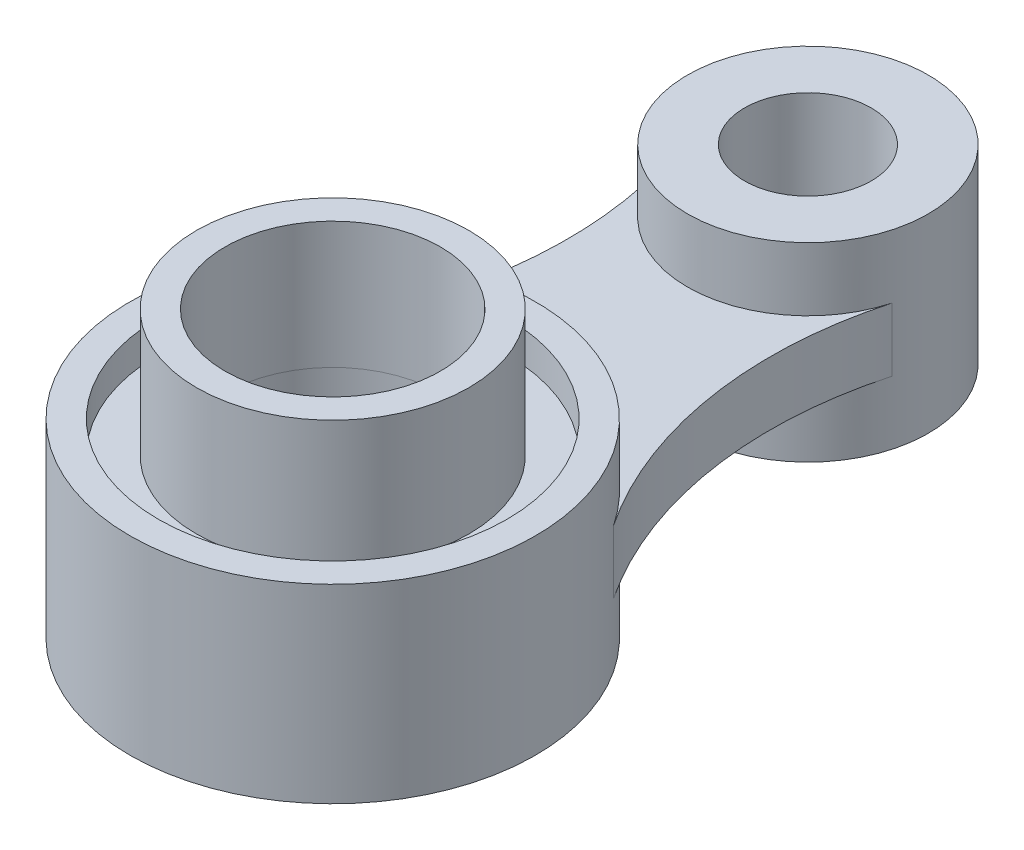
ISO-10303-21;
HEADER;
FILE_DESCRIPTION(('STEP AP214'),'2;1');
FILE_NAME('part.step','',(''),(''),'','','');
FILE_SCHEMA(('AUTOMOTIVE_DESIGN { 1 0 10303 214 1 1 1 1 }'));
ENDSEC;
DATA;
#1=APPLICATION_CONTEXT('core data for automotive mechanical design processes');
#2=APPLICATION_PROTOCOL_DEFINITION('international standard','automotive_design',2000,#1);
#3=PRODUCT_CONTEXT('',#1,'mechanical');
#4=PRODUCT('Part','Part','',(#3));
#5=PRODUCT_RELATED_PRODUCT_CATEGORY('part','',(#4));
#6=PRODUCT_DEFINITION_FORMATION('','',#4);
#7=PRODUCT_DEFINITION_CONTEXT('part definition',#1,'design');
#8=PRODUCT_DEFINITION('design','',#6,#7);
#9=PRODUCT_DEFINITION_SHAPE('','',#8);
#10=(LENGTH_UNIT() NAMED_UNIT(*) SI_UNIT(.MILLI.,.METRE.));
#11=(NAMED_UNIT(*) PLANE_ANGLE_UNIT() SI_UNIT($,.RADIAN.));
#12=(NAMED_UNIT(*) SI_UNIT($,.STERADIAN.) SOLID_ANGLE_UNIT());
#13=UNCERTAINTY_MEASURE_WITH_UNIT(LENGTH_MEASURE(1.E-05),#10,'distance_accuracy_value','');
#14=(GEOMETRIC_REPRESENTATION_CONTEXT(3) GLOBAL_UNCERTAINTY_ASSIGNED_CONTEXT((#13)) GLOBAL_UNIT_ASSIGNED_CONTEXT((#10,
#11,#12)) REPRESENTATION_CONTEXT('',''));
#15=CARTESIAN_POINT('',(0.,0.,0.));
#16=DIRECTION('',(0.,0.,1.));
#17=DIRECTION('',(1.,0.,0.));
#18=AXIS2_PLACEMENT_3D('',#15,#16,#17);
#19=CARTESIAN_POINT('',(0.,45.,37.5));
#20=DIRECTION('',(0.,-1.,0.));
#21=DIRECTION('',(0.,0.,-1.));
#22=AXIS2_PLACEMENT_3D('',#19,#20,#21);
#23=CYLINDRICAL_SURFACE('',#22,21.5);
#24=CARTESIAN_POINT('',(0.,45.,37.5));
#25=DIRECTION('',(0.,1.,0.));
#26=DIRECTION('',(0.,0.,1.));
#27=AXIS2_PLACEMENT_3D('',#24,#25,#26);
#28=CIRCLE('',#27,21.5);
#29=CARTESIAN_POINT('',(0.,45.,59.));
#30=VERTEX_POINT('',#29);
#31=EDGE_CURVE('E11',#30,#30,#28,.T.);
#32=ORIENTED_EDGE('',*,*,#31,.F.);
#33=EDGE_LOOP('',(#32));
#34=FACE_BOUND('',#33,.T.);
#35=CARTESIAN_POINT('',(0.,25.,37.5));
#36=DIRECTION('',(0.,1.,0.));
#37=DIRECTION('',(0.,0.,1.));
#38=AXIS2_PLACEMENT_3D('',#35,#36,#37);
#39=CIRCLE('',#38,21.5);
#40=CARTESIAN_POINT('',(0.,25.,59.));
#41=VERTEX_POINT('',#40);
#42=EDGE_CURVE('E48',#41,#41,#39,.T.);
#43=ORIENTED_EDGE('',*,*,#42,.T.);
#44=EDGE_LOOP('',(#43));
#45=FACE_BOUND('',#44,.T.);
#46=ADVANCED_FACE('F41',(#34,#45),#23,.T.);
#47=CARTESIAN_POINT('',(0.,45.,37.5));
#48=DIRECTION('',(0.,1.,0.));
#49=DIRECTION('',(0.,0.,1.));
#50=AXIS2_PLACEMENT_3D('',#47,#48,#49);
#51=PLANE('',#50);
#52=CARTESIAN_POINT('',(0.,45.,37.5));
#53=DIRECTION('',(0.,1.,0.));
#54=DIRECTION('',(0.,0.,1.));
#55=AXIS2_PLACEMENT_3D('',#52,#53,#54);
#56=CIRCLE('',#55,17.);
#57=CARTESIAN_POINT('',(0.,45.,20.5));
#58=VERTEX_POINT('',#57);
#59=EDGE_CURVE('E54',#58,#58,#56,.T.);
#60=ORIENTED_EDGE('',*,*,#59,.F.);
#61=EDGE_LOOP('',(#60));
#62=FACE_BOUND('',#61,.T.);
#63=ORIENTED_EDGE('',*,*,#31,.T.);
#64=EDGE_LOOP('',(#63));
#65=FACE_BOUND('',#64,.T.);
#66=ADVANCED_FACE('F66',(#62,#65),#51,.T.);
#67=CARTESIAN_POINT('',(0.,25.,37.5));
#68=DIRECTION('',(0.,1.,0.));
#69=DIRECTION('',(0.,0.,1.));
#70=AXIS2_PLACEMENT_3D('',#67,#68,#69);
#71=PLANE('',#70);
#72=CARTESIAN_POINT('',(0.,25.,37.5));
#73=DIRECTION('',(0.,1.,0.));
#74=DIRECTION('',(0.,0.,1.));
#75=AXIS2_PLACEMENT_3D('',#72,#73,#74);
#76=CIRCLE('',#75,17.);
#77=CARTESIAN_POINT('',(0.,25.,20.5));
#78=VERTEX_POINT('',#77);
#79=EDGE_CURVE('E44',#78,#78,#76,.F.);
#80=ORIENTED_EDGE('',*,*,#79,.F.);
#81=EDGE_LOOP('',(#80));
#82=FACE_BOUND('',#81,.T.);
#83=ORIENTED_EDGE('',*,*,#42,.F.);
#84=EDGE_LOOP('',(#83));
#85=FACE_BOUND('',#84,.T.);
#86=ADVANCED_FACE('F63',(#82,#85),#71,.F.);
#87=CARTESIAN_POINT('',(0.,45.,37.5));
#88=DIRECTION('',(0.,-1.,0.));
#89=DIRECTION('',(0.,0.,-1.));
#90=AXIS2_PLACEMENT_3D('',#87,#88,#89);
#91=CYLINDRICAL_SURFACE('',#90,17.);
#92=CARTESIAN_POINT('',(0.,45.,20.5));
#93=CARTESIAN_POINT('',(0.,44.7916666666667,20.5));
#94=CARTESIAN_POINT('',(0.,44.5833333333333,20.5));
#95=CARTESIAN_POINT('',(0.,44.1666666666667,20.5));
#96=CARTESIAN_POINT('',(0.,43.9583333333333,20.5));
#97=CARTESIAN_POINT('',(0.,43.5416666666667,20.5));
#98=CARTESIAN_POINT('',(0.,43.3333333333333,20.5));
#99=CARTESIAN_POINT('',(0.,42.9166666666667,20.5));
#100=CARTESIAN_POINT('',(0.,42.7083333333333,20.5));
#101=CARTESIAN_POINT('',(0.,42.2916666666667,20.5));
#102=CARTESIAN_POINT('',(0.,42.0833333333333,20.5));
#103=CARTESIAN_POINT('',(0.,41.6666666666667,20.5));
#104=CARTESIAN_POINT('',(0.,41.4583333333333,20.5));
#105=CARTESIAN_POINT('',(0.,41.0416666666667,20.5));
#106=CARTESIAN_POINT('',(0.,40.8333333333333,20.5));
#107=CARTESIAN_POINT('',(0.,40.4166666666667,20.5));
#108=CARTESIAN_POINT('',(0.,40.2083333333333,20.5));
#109=CARTESIAN_POINT('',(0.,39.7916666666667,20.5));
#110=CARTESIAN_POINT('',(0.,39.5833333333333,20.5));
#111=CARTESIAN_POINT('',(0.,39.1666666666667,20.5));
#112=CARTESIAN_POINT('',(0.,38.9583333333333,20.5));
#113=CARTESIAN_POINT('',(0.,38.5416666666667,20.5));
#114=CARTESIAN_POINT('',(0.,38.3333333333333,20.5));
#115=CARTESIAN_POINT('',(0.,37.9166666666667,20.5));
#116=CARTESIAN_POINT('',(0.,37.7083333333333,20.5));
#117=CARTESIAN_POINT('',(0.,37.2916666666667,20.5));
#118=CARTESIAN_POINT('',(0.,37.0833333333333,20.5));
#119=CARTESIAN_POINT('',(0.,36.6666666666667,20.5));
#120=CARTESIAN_POINT('',(0.,36.4583333333333,20.5));
#121=CARTESIAN_POINT('',(0.,36.0416666666667,20.5));
#122=CARTESIAN_POINT('',(0.,35.8333333333333,20.5));
#123=CARTESIAN_POINT('',(0.,35.4166666666667,20.5));
#124=CARTESIAN_POINT('',(0.,35.2083333333333,20.5));
#125=CARTESIAN_POINT('',(0.,34.7916666666667,20.5));
#126=CARTESIAN_POINT('',(0.,34.5833333333333,20.5));
#127=CARTESIAN_POINT('',(0.,34.1666666666667,20.5));
#128=CARTESIAN_POINT('',(0.,33.9583333333333,20.5));
#129=CARTESIAN_POINT('',(0.,33.5416666666667,20.5));
#130=CARTESIAN_POINT('',(0.,33.3333333333333,20.5));
#131=CARTESIAN_POINT('',(0.,32.9166666666667,20.5));
#132=CARTESIAN_POINT('',(0.,32.7083333333333,20.5));
#133=CARTESIAN_POINT('',(0.,32.2916666666667,20.5));
#134=CARTESIAN_POINT('',(0.,32.0833333333333,20.5));
#135=CARTESIAN_POINT('',(0.,31.6666666666667,20.5));
#136=CARTESIAN_POINT('',(0.,31.4583333333333,20.5));
#137=CARTESIAN_POINT('',(0.,31.0416666666667,20.5));
#138=CARTESIAN_POINT('',(0.,30.8333333333333,20.5));
#139=CARTESIAN_POINT('',(0.,30.4166666666667,20.5));
#140=CARTESIAN_POINT('',(0.,30.2083333333333,20.5));
#141=CARTESIAN_POINT('',(0.,29.7916666666667,20.5));
#142=CARTESIAN_POINT('',(0.,29.5833333333333,20.5));
#143=CARTESIAN_POINT('',(0.,29.1666666666667,20.5));
#144=CARTESIAN_POINT('',(0.,28.9583333333333,20.5));
#145=CARTESIAN_POINT('',(0.,28.5416666666667,20.5));
#146=CARTESIAN_POINT('',(0.,28.3333333333333,20.5));
#147=CARTESIAN_POINT('',(0.,27.9166666666667,20.5));
#148=CARTESIAN_POINT('',(0.,27.7083333333333,20.5));
#149=CARTESIAN_POINT('',(0.,27.2916666666667,20.5));
#150=CARTESIAN_POINT('',(0.,27.0833333333333,20.5));
#151=CARTESIAN_POINT('',(0.,26.6666666666667,20.5));
#152=CARTESIAN_POINT('',(0.,26.4583333333333,20.5));
#153=CARTESIAN_POINT('',(0.,26.0416666666667,20.5));
#154=CARTESIAN_POINT('',(0.,25.8333333333333,20.5));
#155=CARTESIAN_POINT('',(0.,25.4166666666667,20.5));
#156=CARTESIAN_POINT('',(0.,25.2083333333333,20.5));
#157=CARTESIAN_POINT('',(0.,25.,20.5));
#158=B_SPLINE_CURVE_WITH_KNOTS('',3,(#92,#93,#94,#95,#96,#97,#98,#99,#100,#101,#102,#103,#104,
#105,#106,#107,#108,#109,#110,#111,#112,#113,#114,#115,#116,#117,#118,#119,#120,#121,#122,#123,
#124,#125,#126,#127,#128,#129,#130,#131,#132,#133,#134,#135,#136,#137,#138,#139,#140,#141,#142,
#143,#144,#145,#146,#147,#148,#149,#150,#151,#152,#153,#154,#155,#156,#157),.UNSPECIFIED.,.F.,
.F.,(4,2,2,2,2,2,2,2,2,2,2,2,2,2,2,2,2,2,2,2,2,2,2,2,2,2,2,2,2,2,2,2,4),(0.,0.625000000000001,
1.25,1.875,2.5,3.125,3.75,4.375,5.,5.62500000000001,6.25000000000001,6.87500000000001,7.5,8.125,
8.75,9.375,10.,10.625,11.25,11.875,12.5,13.125,13.75,14.375,15.,15.625,16.25,16.875,17.5,18.125,
18.75,19.375,20.),.UNSPECIFIED.);
#159=EDGE_CURVE('BSEAM61',#58,#78,#158,.T.);
#160=ORIENTED_EDGE('',*,*,#59,.T.);
#161=ORIENTED_EDGE('',*,*,#79,.T.);
#162=ORIENTED_EDGE('',*,*,#159,.T.);
#163=ORIENTED_EDGE('',*,*,#159,.F.);
#164=EDGE_LOOP('',(#160,#162,#161,#163));
#165=FACE_BOUND('',#164,.T.);
#166=ADVANCED_FACE('F61',(#165),#91,.F.);
#167=CLOSED_SHELL('',(#46,#66,#86,#166));
#168=MANIFOLD_SOLID_BREP('B2',#167);
#169=CARTESIAN_POINT('',(0.,30.,-37.5));
#170=DIRECTION('',(0.,-1.,0.));
#171=DIRECTION('',(0.,0.,-1.));
#172=AXIS2_PLACEMENT_3D('',#169,#170,#171);
#173=CYLINDRICAL_SURFACE('',#172,19.);
#174=CARTESIAN_POINT('',(0.,0.,-37.5));
#175=DIRECTION('',(0.,1.,0.));
#176=DIRECTION('',(0.,0.,1.));
#177=AXIS2_PLACEMENT_3D('',#174,#175,#176);
#178=CIRCLE('',#177,19.);
#179=CARTESIAN_POINT('',(0.,0.,-18.5));
#180=VERTEX_POINT('',#179);
#181=EDGE_CURVE('E111',#180,#180,#178,.T.);
#182=ORIENTED_EDGE('',*,*,#181,.T.);
#183=EDGE_LOOP('',(#182));
#184=FACE_BOUND('',#183,.T.);
#185=CARTESIAN_POINT('',(0.,30.,-37.5));
#186=DIRECTION('',(0.,1.,0.));
#187=DIRECTION('',(0.,0.,1.));
#188=AXIS2_PLACEMENT_3D('',#185,#186,#187);
#189=CIRCLE('',#188,19.);
#190=CARTESIAN_POINT('',(0.,30.,-18.5));
#191=VERTEX_POINT('',#190);
#192=EDGE_CURVE('E39',#191,#191,#189,.T.);
#193=ORIENTED_EDGE('',*,*,#192,.F.);
#194=EDGE_LOOP('',(#193));
#195=FACE_BOUND('',#194,.T.);
#196=CARTESIAN_POINT('',(0.,20.,-37.5));
#197=DIRECTION('',(0.,-1.,0.));
#198=DIRECTION('',(0.,0.,1.));
#199=AXIS2_PLACEMENT_3D('',#196,#197,#198);
#200=CIRCLE('',#199,19.);
#201=CARTESIAN_POINT('',(18.3212439861572,20.,-32.4669076305221));
#202=VERTEX_POINT('',#201);
#203=CARTESIAN_POINT('',(-18.3212439861572,20.,-32.4669076305221));
#204=VERTEX_POINT('',#203);
#205=EDGE_CURVE('E128',#202,#204,#200,.T.);
#206=ORIENTED_EDGE('',*,*,#205,.F.);
#207=DIRECTION('',(0.,-1.,0.));
#208=VECTOR('',#207,1.);
#209=CARTESIAN_POINT('',(18.3212439861572,20.,-32.4669076305221));
#210=LINE('',#209,#208);
#211=CARTESIAN_POINT('',(18.3212439861572,10.,-32.4669076305221));
#212=VERTEX_POINT('',#211);
#213=EDGE_CURVE('E164',#202,#212,#210,.T.);
#214=ORIENTED_EDGE('',*,*,#213,.T.);
#215=CARTESIAN_POINT('',(0.,10.,-37.5));
#216=DIRECTION('',(0.,-1.,0.));
#217=DIRECTION('',(0.,0.,1.));
#218=AXIS2_PLACEMENT_3D('',#215,#216,#217);
#219=CIRCLE('',#218,19.);
#220=CARTESIAN_POINT('',(-18.3212439861572,10.,-32.4669076305221));
#221=VERTEX_POINT('',#220);
#222=EDGE_CURVE('E153',#212,#221,#219,.T.);
#223=ORIENTED_EDGE('',*,*,#222,.T.);
#224=DIRECTION('',(0.,-1.,0.));
#225=VECTOR('',#224,1.);
#226=CARTESIAN_POINT('',(-18.3212439861572,20.,-32.4669076305221));
#227=LINE('',#226,#225);
#228=EDGE_CURVE('E174',#204,#221,#227,.T.);
#229=ORIENTED_EDGE('',*,*,#228,.F.);
#230=EDGE_LOOP('',(#206,#214,#223,#229));
#231=FACE_BOUND('',#230,.T.);
#232=ADVANCED_FACE('F103',(#184,#195,#231),#173,.T.);
#233=CARTESIAN_POINT('',(0.,30.,-37.5));
#234=DIRECTION('',(0.,1.,0.));
#235=DIRECTION('',(0.,0.,1.));
#236=AXIS2_PLACEMENT_3D('',#233,#234,#235);
#237=PLANE('',#236);
#238=CARTESIAN_POINT('',(0.,30.,-37.5));
#239=DIRECTION('',(0.,1.,0.));
#240=DIRECTION('',(0.,0.,1.));
#241=AXIS2_PLACEMENT_3D('',#238,#239,#240);
#242=CIRCLE('',#241,10.);
#243=CARTESIAN_POINT('',(0.,30.,-47.5));
#244=VERTEX_POINT('',#243);
#245=EDGE_CURVE('E189',#244,#244,#242,.F.);
#246=ORIENTED_EDGE('',*,*,#245,.T.);
#247=EDGE_LOOP('',(#246));
#248=FACE_BOUND('',#247,.T.);
#249=ORIENTED_EDGE('',*,*,#192,.T.);
#250=EDGE_LOOP('',(#249));
#251=FACE_BOUND('',#250,.T.);
#252=ADVANCED_FACE('F220',(#248,#251),#237,.T.);
#253=CARTESIAN_POINT('',(0.,0.,-37.5));
#254=DIRECTION('',(0.,1.,0.));
#255=DIRECTION('',(0.,0.,1.));
#256=AXIS2_PLACEMENT_3D('',#253,#254,#255);
#257=PLANE('',#256);
#258=CARTESIAN_POINT('',(0.,0.,-37.5));
#259=DIRECTION('',(0.,1.,0.));
#260=DIRECTION('',(0.,0.,1.));
#261=AXIS2_PLACEMENT_3D('',#258,#259,#260);
#262=CIRCLE('',#261,10.);
#263=CARTESIAN_POINT('',(0.,0.,-47.5));
#264=VERTEX_POINT('',#263);
#265=EDGE_CURVE('E106',#264,#264,#262,.F.);
#266=ORIENTED_EDGE('',*,*,#265,.F.);
#267=EDGE_LOOP('',(#266));
#268=FACE_BOUND('',#267,.T.);
#269=ORIENTED_EDGE('',*,*,#181,.F.);
#270=EDGE_LOOP('',(#269));
#271=FACE_BOUND('',#270,.T.);
#272=ADVANCED_FACE('F213',(#268,#271),#257,.F.);
#273=CARTESIAN_POINT('',(-80.034907939529,20.,-15.5133333333333));
#274=DIRECTION('',(0.,-1.,0.));
#275=DIRECTION('',(0.,0.,-1.));
#276=AXIS2_PLACEMENT_3D('',#273,#274,#275);
#277=CYLINDRICAL_SURFACE('',#276,64.);
#278=CARTESIAN_POINT('',(-80.034907939529,10.,-15.5133333333333));
#279=DIRECTION('',(0.,-1.,0.));
#280=DIRECTION('',(0.,0.,-1.));
#281=AXIS2_PLACEMENT_3D('',#278,#279,#280);
#282=CIRCLE('',#281,64.);
#283=CARTESIAN_POINT('',(-26.6783026465097,10.,19.8288888888889));
#284=VERTEX_POINT('',#283);
#285=EDGE_CURVE('E119',#221,#284,#282,.T.);
#286=ORIENTED_EDGE('',*,*,#285,.T.);
#287=DIRECTION('',(0.,-1.,0.));
#288=VECTOR('',#287,1.);
#289=CARTESIAN_POINT('',(-26.6783026465097,20.,19.8288888888889));
#290=LINE('',#289,#288);
#291=CARTESIAN_POINT('',(-26.6783026465097,20.,19.8288888888889));
#292=VERTEX_POINT('',#291);
#293=EDGE_CURVE('E163',#292,#284,#290,.T.);
#294=ORIENTED_EDGE('',*,*,#293,.F.);
#295=CARTESIAN_POINT('',(-80.034907939529,20.,-15.5133333333333));
#296=DIRECTION('',(0.,-1.,0.));
#297=DIRECTION('',(0.,0.,-1.));
#298=AXIS2_PLACEMENT_3D('',#295,#296,#297);
#299=CIRCLE('',#298,64.);
#300=EDGE_CURVE('E146',#204,#292,#299,.T.);
#301=ORIENTED_EDGE('',*,*,#300,.F.);
#302=ORIENTED_EDGE('',*,*,#228,.T.);
#303=EDGE_LOOP('',(#286,#294,#301,#302));
#304=FACE_BOUND('',#303,.T.);
#305=ADVANCED_FACE('F211',(#304),#277,.F.);
#306=CARTESIAN_POINT('',(80.034907939529,20.,-15.5133333333333));
#307=DIRECTION('',(0.,-1.,0.));
#308=DIRECTION('',(0.,0.,-1.));
#309=AXIS2_PLACEMENT_3D('',#306,#307,#308);
#310=CYLINDRICAL_SURFACE('',#309,64.);
#311=CARTESIAN_POINT('',(80.034907939529,10.,-15.5133333333333));
#312=DIRECTION('',(0.,-1.,0.));
#313=DIRECTION('',(0.,0.,1.));
#314=AXIS2_PLACEMENT_3D('',#311,#312,#313);
#315=CIRCLE('',#314,64.);
#316=CARTESIAN_POINT('',(26.6783026465097,10.,19.8288888888889));
#317=VERTEX_POINT('',#316);
#318=EDGE_CURVE('E143',#317,#212,#315,.T.);
#319=ORIENTED_EDGE('',*,*,#318,.T.);
#320=ORIENTED_EDGE('',*,*,#213,.F.);
#321=CARTESIAN_POINT('',(80.034907939529,20.,-15.5133333333333));
#322=DIRECTION('',(0.,-1.,0.));
#323=DIRECTION('',(0.,0.,1.));
#324=AXIS2_PLACEMENT_3D('',#321,#322,#323);
#325=CIRCLE('',#324,64.);
#326=CARTESIAN_POINT('',(26.6783026465097,20.,19.8288888888889));
#327=VERTEX_POINT('',#326);
#328=EDGE_CURVE('E160',#327,#202,#325,.T.);
#329=ORIENTED_EDGE('',*,*,#328,.F.);
#330=DIRECTION('',(0.,-1.,0.));
#331=VECTOR('',#330,1.);
#332=CARTESIAN_POINT('',(26.6783026465097,20.,19.8288888888889));
#333=LINE('',#332,#331);
#334=EDGE_CURVE('E158',#327,#317,#333,.T.);
#335=ORIENTED_EDGE('',*,*,#334,.T.);
#336=EDGE_LOOP('',(#319,#320,#329,#335));
#337=FACE_BOUND('',#336,.T.);
#338=ADVANCED_FACE('F159',(#337),#310,.F.);
#339=CARTESIAN_POINT('',(-40.0174539697645,20.,10.9933333333333));
#340=DIRECTION('',(0.,-1.,0.));
#341=DIRECTION('',(0.,0.,-1.));
#342=AXIS2_PLACEMENT_3D('',#339,#340,#341);
#343=PLANE('',#342);
#344=ORIENTED_EDGE('',*,*,#300,.T.);
#345=CARTESIAN_POINT('',(0.,20.,37.5));
#346=DIRECTION('',(0.,-1.,0.));
#347=DIRECTION('',(0.,0.,1.));
#348=AXIS2_PLACEMENT_3D('',#345,#346,#347);
#349=CIRCLE('',#348,32.);
#350=EDGE_CURVE('E205',#292,#327,#349,.T.);
#351=ORIENTED_EDGE('',*,*,#350,.T.);
#352=ORIENTED_EDGE('',*,*,#328,.T.);
#353=ORIENTED_EDGE('',*,*,#205,.T.);
#354=EDGE_LOOP('',(#344,#351,#352,#353));
#355=FACE_BOUND('',#354,.T.);
#356=ADVANCED_FACE('F207',(#355),#343,.F.);
#357=CARTESIAN_POINT('',(-40.0174539697645,10.,10.9933333333333));
#358=DIRECTION('',(0.,-1.,0.));
#359=DIRECTION('',(0.,0.,-1.));
#360=AXIS2_PLACEMENT_3D('',#357,#358,#359);
#361=PLANE('',#360);
#362=ORIENTED_EDGE('',*,*,#285,.F.);
#363=ORIENTED_EDGE('',*,*,#222,.F.);
#364=ORIENTED_EDGE('',*,*,#318,.F.);
#365=CARTESIAN_POINT('',(0.,10.,37.5));
#366=DIRECTION('',(0.,-1.,0.));
#367=DIRECTION('',(0.,0.,1.));
#368=AXIS2_PLACEMENT_3D('',#365,#366,#367);
#369=CIRCLE('',#368,32.);
#370=EDGE_CURVE('E151',#284,#317,#369,.T.);
#371=ORIENTED_EDGE('',*,*,#370,.F.);
#372=EDGE_LOOP('',(#362,#363,#364,#371));
#373=FACE_BOUND('',#372,.T.);
#374=ADVANCED_FACE('F149',(#373),#361,.T.);
#375=CARTESIAN_POINT('',(0.,30.,37.5));
#376=DIRECTION('',(0.,-1.,0.));
#377=DIRECTION('',(0.,0.,-1.));
#378=AXIS2_PLACEMENT_3D('',#375,#376,#377);
#379=CYLINDRICAL_SURFACE('',#378,32.);
#380=CARTESIAN_POINT('',(0.,30.,37.5));
#381=DIRECTION('',(0.,1.,0.));
#382=DIRECTION('',(0.,0.,1.));
#383=AXIS2_PLACEMENT_3D('',#380,#381,#382);
#384=CIRCLE('',#383,32.);
#385=CARTESIAN_POINT('',(0.,30.,69.5));
#386=VERTEX_POINT('',#385);
#387=EDGE_CURVE('E169',#386,#386,#384,.T.);
#388=ORIENTED_EDGE('',*,*,#387,.F.);
#389=EDGE_LOOP('',(#388));
#390=FACE_BOUND('',#389,.T.);
#391=CARTESIAN_POINT('',(0.,0.,37.5));
#392=DIRECTION('',(0.,1.,0.));
#393=DIRECTION('',(0.,0.,1.));
#394=AXIS2_PLACEMENT_3D('',#391,#392,#393);
#395=CIRCLE('',#394,32.);
#396=CARTESIAN_POINT('',(0.,0.,69.5));
#397=VERTEX_POINT('',#396);
#398=EDGE_CURVE('E197',#397,#397,#395,.T.);
#399=ORIENTED_EDGE('',*,*,#398,.T.);
#400=EDGE_LOOP('',(#399));
#401=FACE_BOUND('',#400,.T.);
#402=ORIENTED_EDGE('',*,*,#334,.F.);
#403=ORIENTED_EDGE('',*,*,#350,.F.);
#404=ORIENTED_EDGE('',*,*,#293,.T.);
#405=ORIENTED_EDGE('',*,*,#370,.T.);
#406=EDGE_LOOP('',(#402,#403,#404,#405));
#407=FACE_BOUND('',#406,.T.);
#408=ADVANCED_FACE('F167',(#390,#401,#407),#379,.T.);
#409=CARTESIAN_POINT('',(0.,30.,37.5));
#410=DIRECTION('',(0.,1.,0.));
#411=DIRECTION('',(0.,0.,1.));
#412=AXIS2_PLACEMENT_3D('',#409,#410,#411);
#413=PLANE('',#412);
#414=CARTESIAN_POINT('',(0.,30.,37.5));
#415=DIRECTION('',(0.,1.,0.));
#416=DIRECTION('',(0.,0.,1.));
#417=AXIS2_PLACEMENT_3D('',#414,#415,#416);
#418=CIRCLE('',#417,27.5);
#419=CARTESIAN_POINT('',(0.,30.,65.));
#420=VERTEX_POINT('',#419);
#421=EDGE_CURVE('E194',#420,#420,#418,.T.);
#422=ORIENTED_EDGE('',*,*,#421,.F.);
#423=EDGE_LOOP('',(#422));
#424=FACE_BOUND('',#423,.T.);
#425=ORIENTED_EDGE('',*,*,#387,.T.);
#426=EDGE_LOOP('',(#425));
#427=FACE_BOUND('',#426,.T.);
#428=ADVANCED_FACE('F258',(#424,#427),#413,.T.);
#429=CARTESIAN_POINT('',(0.,0.,37.5));
#430=DIRECTION('',(0.,1.,0.));
#431=DIRECTION('',(0.,0.,1.));
#432=AXIS2_PLACEMENT_3D('',#429,#430,#431);
#433=PLANE('',#432);
#434=CARTESIAN_POINT('',(0.,0.,37.5));
#435=DIRECTION('',(0.,1.,0.));
#436=DIRECTION('',(0.,0.,1.));
#437=AXIS2_PLACEMENT_3D('',#434,#435,#436);
#438=CIRCLE('',#437,17.);
#439=CARTESIAN_POINT('',(0.,0.,20.5));
#440=VERTEX_POINT('',#439);
#441=EDGE_CURVE('E181',#440,#440,#438,.F.);
#442=ORIENTED_EDGE('',*,*,#441,.F.);
#443=EDGE_LOOP('',(#442));
#444=FACE_BOUND('',#443,.T.);
#445=ORIENTED_EDGE('',*,*,#398,.F.);
#446=EDGE_LOOP('',(#445));
#447=FACE_BOUND('',#446,.T.);
#448=ADVANCED_FACE('F256',(#444,#447),#433,.F.);
#449=CARTESIAN_POINT('',(0.,30.,37.5));
#450=DIRECTION('',(0.,-1.,0.));
#451=DIRECTION('',(0.,0.,-1.));
#452=AXIS2_PLACEMENT_3D('',#449,#450,#451);
#453=CYLINDRICAL_SURFACE('',#452,27.5);
#454=ORIENTED_EDGE('',*,*,#421,.T.);
#455=EDGE_LOOP('',(#454));
#456=FACE_BOUND('',#455,.T.);
#457=CARTESIAN_POINT('',(0.,25.,37.5));
#458=DIRECTION('',(0.,1.,0.));
#459=DIRECTION('',(0.,0.,1.));
#460=AXIS2_PLACEMENT_3D('',#457,#458,#459);
#461=CIRCLE('',#460,27.5);
#462=CARTESIAN_POINT('',(0.,25.,65.));
#463=VERTEX_POINT('',#462);
#464=EDGE_CURVE('E193',#463,#463,#461,.T.);
#465=ORIENTED_EDGE('',*,*,#464,.F.);
#466=EDGE_LOOP('',(#465));
#467=FACE_BOUND('',#466,.T.);
#468=ADVANCED_FACE('F253',(#456,#467),#453,.F.);
#469=CARTESIAN_POINT('',(0.,25.,37.5));
#470=DIRECTION('',(0.,1.,0.));
#471=DIRECTION('',(0.,0.,1.));
#472=AXIS2_PLACEMENT_3D('',#469,#470,#471);
#473=PLANE('',#472);
#474=CARTESIAN_POINT('',(0.,25.,37.5));
#475=DIRECTION('',(0.,1.,0.));
#476=DIRECTION('',(0.,0.,1.));
#477=AXIS2_PLACEMENT_3D('',#474,#475,#476);
#478=CIRCLE('',#477,17.);
#479=CARTESIAN_POINT('',(0.,25.,20.5));
#480=VERTEX_POINT('',#479);
#481=EDGE_CURVE('E179',#480,#480,#478,.F.);
#482=ORIENTED_EDGE('',*,*,#481,.T.);
#483=EDGE_LOOP('',(#482));
#484=FACE_BOUND('',#483,.T.);
#485=ORIENTED_EDGE('',*,*,#464,.T.);
#486=EDGE_LOOP('',(#485));
#487=FACE_BOUND('',#486,.T.);
#488=ADVANCED_FACE('F247',(#484,#487),#473,.T.);
#489=CARTESIAN_POINT('',(0.,45.,37.5));
#490=DIRECTION('',(0.,-1.,0.));
#491=DIRECTION('',(0.,0.,-1.));
#492=AXIS2_PLACEMENT_3D('',#489,#490,#491);
#493=CYLINDRICAL_SURFACE('',#492,17.);
#494=CARTESIAN_POINT('',(0.,25.,20.5));
#495=CARTESIAN_POINT('',(0.,24.7395833333333,20.5));
#496=CARTESIAN_POINT('',(0.,24.4791666666667,20.5));
#497=CARTESIAN_POINT('',(0.,23.9583333333333,20.5));
#498=CARTESIAN_POINT('',(0.,23.6979166666667,20.5));
#499=CARTESIAN_POINT('',(0.,23.1770833333333,20.5));
#500=CARTESIAN_POINT('',(0.,22.9166666666667,20.5));
#501=CARTESIAN_POINT('',(0.,22.3958333333333,20.5));
#502=CARTESIAN_POINT('',(0.,22.1354166666667,20.5));
#503=CARTESIAN_POINT('',(0.,21.6145833333333,20.5));
#504=CARTESIAN_POINT('',(0.,21.3541666666667,20.5));
#505=CARTESIAN_POINT('',(0.,20.8333333333333,20.5));
#506=CARTESIAN_POINT('',(0.,20.5729166666667,20.5));
#507=CARTESIAN_POINT('',(0.,20.0520833333333,20.5));
#508=CARTESIAN_POINT('',(0.,19.7916666666667,20.5));
#509=CARTESIAN_POINT('',(0.,19.2708333333333,20.5));
#510=CARTESIAN_POINT('',(0.,19.0104166666667,20.5));
#511=CARTESIAN_POINT('',(0.,18.4895833333333,20.5));
#512=CARTESIAN_POINT('',(0.,18.2291666666667,20.5));
#513=CARTESIAN_POINT('',(0.,17.7083333333333,20.5));
#514=CARTESIAN_POINT('',(0.,17.4479166666667,20.5));
#515=CARTESIAN_POINT('',(0.,16.9270833333333,20.5));
#516=CARTESIAN_POINT('',(0.,16.6666666666667,20.5));
#517=CARTESIAN_POINT('',(0.,16.1458333333333,20.5));
#518=CARTESIAN_POINT('',(0.,15.8854166666667,20.5));
#519=CARTESIAN_POINT('',(0.,15.3645833333333,20.5));
#520=CARTESIAN_POINT('',(0.,15.1041666666667,20.5));
#521=CARTESIAN_POINT('',(0.,14.5833333333333,20.5));
#522=CARTESIAN_POINT('',(0.,14.3229166666667,20.5));
#523=CARTESIAN_POINT('',(0.,13.8020833333333,20.5));
#524=CARTESIAN_POINT('',(0.,13.5416666666667,20.5));
#525=CARTESIAN_POINT('',(0.,13.0208333333333,20.5));
#526=CARTESIAN_POINT('',(0.,12.7604166666667,20.5));
#527=CARTESIAN_POINT('',(0.,12.2395833333333,20.5));
#528=CARTESIAN_POINT('',(0.,11.9791666666667,20.5));
#529=CARTESIAN_POINT('',(0.,11.4583333333333,20.5));
#530=CARTESIAN_POINT('',(0.,11.1979166666667,20.5));
#531=CARTESIAN_POINT('',(0.,10.6770833333333,20.5));
#532=CARTESIAN_POINT('',(0.,10.4166666666667,20.5));
#533=CARTESIAN_POINT('',(0.,9.89583333333333,20.5));
#534=CARTESIAN_POINT('',(0.,9.63541666666666,20.5));
#535=CARTESIAN_POINT('',(0.,9.11458333333333,20.5));
#536=CARTESIAN_POINT('',(0.,8.85416666666666,20.5));
#537=CARTESIAN_POINT('',(0.,8.33333333333333,20.5));
#538=CARTESIAN_POINT('',(0.,8.07291666666666,20.5));
#539=CARTESIAN_POINT('',(0.,7.55208333333333,20.5));
#540=CARTESIAN_POINT('',(0.,7.29166666666666,20.5));
#541=CARTESIAN_POINT('',(0.,6.77083333333333,20.5));
#542=CARTESIAN_POINT('',(0.,6.51041666666666,20.5));
#543=CARTESIAN_POINT('',(0.,5.98958333333333,20.5));
#544=CARTESIAN_POINT('',(0.,5.72916666666666,20.5));
#545=CARTESIAN_POINT('',(0.,5.20833333333333,20.5));
#546=CARTESIAN_POINT('',(0.,4.94791666666666,20.5));
#547=CARTESIAN_POINT('',(0.,4.42708333333332,20.5));
#548=CARTESIAN_POINT('',(0.,4.16666666666666,20.5));
#549=CARTESIAN_POINT('',(0.,3.64583333333333,20.5));
#550=CARTESIAN_POINT('',(0.,3.38541666666666,20.5));
#551=CARTESIAN_POINT('',(0.,2.86458333333333,20.5));
#552=CARTESIAN_POINT('',(0.,2.60416666666666,20.5));
#553=CARTESIAN_POINT('',(0.,2.08333333333333,20.5));
#554=CARTESIAN_POINT('',(0.,1.82291666666666,20.5));
#555=CARTESIAN_POINT('',(0.,1.30208333333333,20.5));
#556=CARTESIAN_POINT('',(0.,1.04166666666666,20.5));
#557=CARTESIAN_POINT('',(0.,0.520833333333325,20.5));
#558=CARTESIAN_POINT('',(0.,0.260416666666659,20.5));
#559=CARTESIAN_POINT('',(0.,0.,20.5));
#560=B_SPLINE_CURVE_WITH_KNOTS('',3,(#494,#495,#496,#497,#498,#499,#500,#501,#502,#503,#504,
#505,#506,#507,#508,#509,#510,#511,#512,#513,#514,#515,#516,#517,#518,#519,#520,#521,#522,#523,
#524,#525,#526,#527,#528,#529,#530,#531,#532,#533,#534,#535,#536,#537,#538,#539,#540,#541,#542,
#543,#544,#545,#546,#547,#548,#549,#550,#551,#552,#553,#554,#555,#556,#557,#558,#559),
.UNSPECIFIED.,.F.,.F.,(4,2,2,2,2,2,2,2,2,2,2,2,2,2,2,2,2,2,2,2,2,2,2,2,2,2,2,2,2,2,2,2,4),(0.,
0.781250000000001,1.5625,2.34375,3.125,3.90625,4.6875,5.46875,6.25,7.03125,7.8125,8.59375,9.375,
10.15625,10.9375,11.71875,12.5,13.28125,14.0625,14.84375,15.625,16.40625,17.1875,17.96875,18.75,
19.53125,20.3125,21.09375,21.875,22.65625,23.4375,24.21875,25.),.UNSPECIFIED.);
#561=EDGE_CURVE('BSEAM241',#480,#440,#560,.T.);
#562=ORIENTED_EDGE('',*,*,#481,.F.);
#563=ORIENTED_EDGE('',*,*,#441,.T.);
#564=ORIENTED_EDGE('',*,*,#561,.T.);
#565=ORIENTED_EDGE('',*,*,#561,.F.);
#566=EDGE_LOOP('',(#562,#564,#563,#565));
#567=FACE_BOUND('',#566,.T.);
#568=ADVANCED_FACE('F241',(#567),#493,.F.);
#569=CARTESIAN_POINT('',(0.,45.,-37.5));
#570=DIRECTION('',(0.,-1.,0.));
#571=DIRECTION('',(0.,0.,-1.));
#572=AXIS2_PLACEMENT_3D('',#569,#570,#571);
#573=CYLINDRICAL_SURFACE('',#572,10.);
#574=CARTESIAN_POINT('',(0.,30.,-47.5));
#575=CARTESIAN_POINT('',(0.,29.6875,-47.5));
#576=CARTESIAN_POINT('',(0.,29.375,-47.5));
#577=CARTESIAN_POINT('',(0.,28.75,-47.5));
#578=CARTESIAN_POINT('',(0.,28.4375,-47.5));
#579=CARTESIAN_POINT('',(0.,27.8125,-47.5));
#580=CARTESIAN_POINT('',(0.,27.5,-47.5));
#581=CARTESIAN_POINT('',(0.,26.875,-47.5));
#582=CARTESIAN_POINT('',(0.,26.5625,-47.5));
#583=CARTESIAN_POINT('',(0.,25.9375,-47.5));
#584=CARTESIAN_POINT('',(0.,25.625,-47.5));
#585=CARTESIAN_POINT('',(0.,25.,-47.5));
#586=CARTESIAN_POINT('',(0.,24.6875,-47.5));
#587=CARTESIAN_POINT('',(0.,24.0625,-47.5));
#588=CARTESIAN_POINT('',(0.,23.75,-47.5));
#589=CARTESIAN_POINT('',(0.,23.125,-47.5));
#590=CARTESIAN_POINT('',(0.,22.8125,-47.5));
#591=CARTESIAN_POINT('',(0.,22.1875,-47.5));
#592=CARTESIAN_POINT('',(0.,21.875,-47.5));
#593=CARTESIAN_POINT('',(0.,21.25,-47.5));
#594=CARTESIAN_POINT('',(0.,20.9375,-47.5));
#595=CARTESIAN_POINT('',(0.,20.3125,-47.5));
#596=CARTESIAN_POINT('',(0.,20.,-47.5));
#597=CARTESIAN_POINT('',(0.,19.375,-47.5));
#598=CARTESIAN_POINT('',(0.,19.0625,-47.5));
#599=CARTESIAN_POINT('',(0.,18.4375,-47.5));
#600=CARTESIAN_POINT('',(0.,18.125,-47.5));
#601=CARTESIAN_POINT('',(0.,17.5,-47.5));
#602=CARTESIAN_POINT('',(0.,17.1875,-47.5));
#603=CARTESIAN_POINT('',(0.,16.5625,-47.5));
#604=CARTESIAN_POINT('',(0.,16.25,-47.5));
#605=CARTESIAN_POINT('',(0.,15.625,-47.5));
#606=CARTESIAN_POINT('',(0.,15.3125,-47.5));
#607=CARTESIAN_POINT('',(0.,14.6875,-47.5));
#608=CARTESIAN_POINT('',(0.,14.375,-47.5));
#609=CARTESIAN_POINT('',(0.,13.75,-47.5));
#610=CARTESIAN_POINT('',(0.,13.4375,-47.5));
#611=CARTESIAN_POINT('',(0.,12.8125,-47.5));
#612=CARTESIAN_POINT('',(0.,12.5,-47.5));
#613=CARTESIAN_POINT('',(0.,11.875,-47.5));
#614=CARTESIAN_POINT('',(0.,11.5625,-47.5));
#615=CARTESIAN_POINT('',(0.,10.9375,-47.5));
#616=CARTESIAN_POINT('',(0.,10.625,-47.5));
#617=CARTESIAN_POINT('',(0.,9.99999999999999,-47.5));
#618=CARTESIAN_POINT('',(0.,9.68749999999999,-47.5));
#619=CARTESIAN_POINT('',(0.,9.06249999999999,-47.5));
#620=CARTESIAN_POINT('',(0.,8.74999999999999,-47.5));
#621=CARTESIAN_POINT('',(0.,8.12499999999999,-47.5));
#622=CARTESIAN_POINT('',(0.,7.8125,-47.5));
#623=CARTESIAN_POINT('',(0.,7.1875,-47.5));
#624=CARTESIAN_POINT('',(0.,6.87499999999999,-47.5));
#625=CARTESIAN_POINT('',(0.,6.24999999999999,-47.5));
#626=CARTESIAN_POINT('',(0.,5.9375,-47.5));
#627=CARTESIAN_POINT('',(0.,5.3125,-47.5));
#628=CARTESIAN_POINT('',(0.,4.99999999999999,-47.5));
#629=CARTESIAN_POINT('',(0.,4.37499999999999,-47.5));
#630=CARTESIAN_POINT('',(0.,4.06249999999999,-47.5));
#631=CARTESIAN_POINT('',(0.,3.4375,-47.5));
#632=CARTESIAN_POINT('',(0.,3.125,-47.5));
#633=CARTESIAN_POINT('',(0.,2.5,-47.5));
#634=CARTESIAN_POINT('',(0.,2.1875,-47.5));
#635=CARTESIAN_POINT('',(0.,1.56249999999999,-47.5));
#636=CARTESIAN_POINT('',(0.,1.24999999999999,-47.5));
#637=CARTESIAN_POINT('',(0.,0.624999999999994,-47.5));
#638=CARTESIAN_POINT('',(0.,0.312499999999993,-47.5));
#639=CARTESIAN_POINT('',(0.,0.,-47.5));
#640=B_SPLINE_CURVE_WITH_KNOTS('',3,(#574,#575,#576,#577,#578,#579,#580,#581,#582,#583,#584,
#585,#586,#587,#588,#589,#590,#591,#592,#593,#594,#595,#596,#597,#598,#599,#600,#601,#602,#603,
#604,#605,#606,#607,#608,#609,#610,#611,#612,#613,#614,#615,#616,#617,#618,#619,#620,#621,#622,
#623,#624,#625,#626,#627,#628,#629,#630,#631,#632,#633,#634,#635,#636,#637,#638,#639),
.UNSPECIFIED.,.F.,.F.,(4,2,2,2,2,2,2,2,2,2,2,2,2,2,2,2,2,2,2,2,2,2,2,2,2,2,2,2,2,2,2,2,4),(0.,
0.937500000000001,1.875,2.8125,3.75,4.6875,5.625,6.5625,7.5,8.4375,9.37500000000001,10.3125,
11.25,12.1875,13.125,14.0625,15.,15.9375,16.875,17.8125,18.75,19.6875,20.625,21.5625,22.5,
23.4375,24.375,25.3125,26.25,27.1875,28.125,29.0625,30.),.UNSPECIFIED.);
#641=EDGE_CURVE('BSEAM238',#244,#264,#640,.T.);
#642=ORIENTED_EDGE('',*,*,#245,.F.);
#643=ORIENTED_EDGE('',*,*,#265,.T.);
#644=ORIENTED_EDGE('',*,*,#641,.T.);
#645=ORIENTED_EDGE('',*,*,#641,.F.);
#646=EDGE_LOOP('',(#642,#644,#643,#645));
#647=FACE_BOUND('',#646,.T.);
#648=ADVANCED_FACE('F238',(#647),#573,.F.);
#649=CLOSED_SHELL('',(#232,#252,#272,#305,#338,#356,#374,#408,#428,#448,#468,#488,#568,#648));
#650=MANIFOLD_SOLID_BREP('B6',#649);
#651=ADVANCED_BREP_SHAPE_REPRESENTATION('',(#18,#168,#650),#14);
#652=SHAPE_DEFINITION_REPRESENTATION(#9,#651);
ENDSEC;
END-ISO-10303-21;
